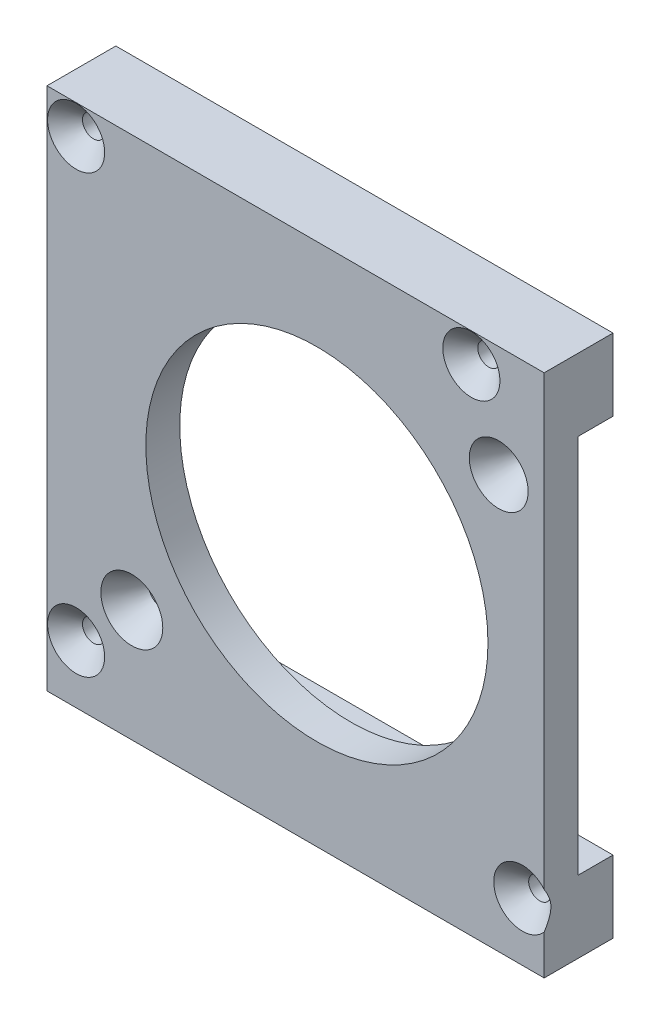
ISO-10303-21;
HEADER;
FILE_DESCRIPTION(('STEP AP214'),'2;1');
FILE_NAME('part.step','',(''),(''),'','','');
FILE_SCHEMA(('AUTOMOTIVE_DESIGN { 1 0 10303 214 1 1 1 1 }'));
ENDSEC;
DATA;
#1=APPLICATION_CONTEXT('core data for automotive mechanical design processes');
#2=APPLICATION_PROTOCOL_DEFINITION('international standard','automotive_design',2000,#1);
#3=PRODUCT_CONTEXT('',#1,'mechanical');
#4=PRODUCT('Part','Part','',(#3));
#5=PRODUCT_RELATED_PRODUCT_CATEGORY('part','',(#4));
#6=PRODUCT_DEFINITION_FORMATION('','',#4);
#7=PRODUCT_DEFINITION_CONTEXT('part definition',#1,'design');
#8=PRODUCT_DEFINITION('design','',#6,#7);
#9=PRODUCT_DEFINITION_SHAPE('','',#8);
#10=(LENGTH_UNIT() NAMED_UNIT(*) SI_UNIT(.MILLI.,.METRE.));
#11=(NAMED_UNIT(*) PLANE_ANGLE_UNIT() SI_UNIT($,.RADIAN.));
#12=(NAMED_UNIT(*) SI_UNIT($,.STERADIAN.) SOLID_ANGLE_UNIT());
#13=UNCERTAINTY_MEASURE_WITH_UNIT(LENGTH_MEASURE(1.E-05),#10,'distance_accuracy_value','');
#14=(GEOMETRIC_REPRESENTATION_CONTEXT(3) GLOBAL_UNCERTAINTY_ASSIGNED_CONTEXT((#13)) GLOBAL_UNIT_ASSIGNED_CONTEXT((#10,
#11,#12)) REPRESENTATION_CONTEXT('',''));
#15=CARTESIAN_POINT('',(0.,0.,0.));
#16=DIRECTION('',(0.,0.,1.));
#17=DIRECTION('',(1.,0.,0.));
#18=AXIS2_PLACEMENT_3D('',#15,#16,#17);
#19=CARTESIAN_POINT('',(-16.575,18.,2.4));
#20=DIRECTION('',(0.,-1.,0.));
#21=DIRECTION('',(0.,0.,-1.));
#22=AXIS2_PLACEMENT_3D('',#19,#20,#21);
#23=PLANE('',#22);
#24=DIRECTION('',(-1.,0.,0.));
#25=VECTOR('',#24,1.);
#26=CARTESIAN_POINT('',(-16.575,18.,0.));
#27=LINE('',#26,#25);
#28=CARTESIAN_POINT('',(16.575,18.,0.));
#29=VERTEX_POINT('',#28);
#30=CARTESIAN_POINT('',(-17.575,18.,0.));
#31=VERTEX_POINT('',#30);
#32=EDGE_CURVE('E117',#29,#31,#27,.T.);
#33=ORIENTED_EDGE('',*,*,#32,.T.);
#34=DIRECTION('',(0.,0.,-1.));
#35=VECTOR('',#34,1.);
#36=CARTESIAN_POINT('',(-17.575,18.,0.));
#37=LINE('',#36,#35);
#38=CARTESIAN_POINT('',(-17.575,18.,4.73));
#39=VERTEX_POINT('',#38);
#40=EDGE_CURVE('E132',#39,#31,#37,.T.);
#41=ORIENTED_EDGE('',*,*,#40,.F.);
#42=DIRECTION('',(-1.,0.,0.));
#43=VECTOR('',#42,1.);
#44=CARTESIAN_POINT('',(0.,18.,4.73));
#45=LINE('',#44,#43);
#46=CARTESIAN_POINT('',(16.575,18.,4.73));
#47=VERTEX_POINT('',#46);
#48=EDGE_CURVE('E152',#47,#39,#45,.T.);
#49=ORIENTED_EDGE('',*,*,#48,.F.);
#50=DIRECTION('',(0.,0.,-1.));
#51=VECTOR('',#50,1.);
#52=CARTESIAN_POINT('',(16.575,18.,2.4));
#53=LINE('',#52,#51);
#54=EDGE_CURVE('E204',#47,#29,#53,.T.);
#55=ORIENTED_EDGE('',*,*,#54,.T.);
#56=EDGE_LOOP('',(#33,#41,#49,#55));
#57=FACE_BOUND('',#56,.T.);
#58=ADVANCED_FACE('F35',(#57),#23,.F.);
#59=CARTESIAN_POINT('',(-16.575,-18.,2.4));
#60=DIRECTION('',(0.,1.,0.));
#61=DIRECTION('',(0.,0.,1.));
#62=AXIS2_PLACEMENT_3D('',#59,#60,#61);
#63=PLANE('',#62);
#64=DIRECTION('',(1.,0.,0.));
#65=VECTOR('',#64,1.);
#66=CARTESIAN_POINT('',(-16.575,-18.,0.));
#67=LINE('',#66,#65);
#68=CARTESIAN_POINT('',(-17.575,-18.,0.));
#69=VERTEX_POINT('',#68);
#70=CARTESIAN_POINT('',(16.575,-18.,0.));
#71=VERTEX_POINT('',#70);
#72=EDGE_CURVE('E106',#69,#71,#67,.T.);
#73=ORIENTED_EDGE('',*,*,#72,.T.);
#74=DIRECTION('',(0.,0.,-1.));
#75=VECTOR('',#74,1.);
#76=CARTESIAN_POINT('',(16.575,-18.,2.4));
#77=LINE('',#76,#75);
#78=CARTESIAN_POINT('',(16.575,-18.,4.73));
#79=VERTEX_POINT('',#78);
#80=EDGE_CURVE('E202',#79,#71,#77,.T.);
#81=ORIENTED_EDGE('',*,*,#80,.F.);
#82=DIRECTION('',(1.,0.,0.));
#83=VECTOR('',#82,1.);
#84=CARTESIAN_POINT('',(0.,-18.,4.73));
#85=LINE('',#84,#83);
#86=CARTESIAN_POINT('',(-17.575,-18.,4.73));
#87=VERTEX_POINT('',#86);
#88=EDGE_CURVE('E123',#87,#79,#85,.T.);
#89=ORIENTED_EDGE('',*,*,#88,.F.);
#90=DIRECTION('',(0.,0.,1.));
#91=VECTOR('',#90,1.);
#92=CARTESIAN_POINT('',(-17.575,-18.,0.));
#93=LINE('',#92,#91);
#94=EDGE_CURVE('E120',#69,#87,#93,.T.);
#95=ORIENTED_EDGE('',*,*,#94,.F.);
#96=EDGE_LOOP('',(#73,#81,#89,#95));
#97=FACE_BOUND('',#96,.T.);
#98=ADVANCED_FACE('F121',(#97),#63,.F.);
#99=CARTESIAN_POINT('',(16.575,-18.,2.4));
#100=DIRECTION('',(-1.,0.,0.));
#101=DIRECTION('',(0.,0.,1.));
#102=AXIS2_PLACEMENT_3D('',#99,#100,#101);
#103=PLANE('',#102);
#104=DIRECTION('',(0.,-1.,0.));
#105=VECTOR('',#104,1.);
#106=CARTESIAN_POINT('',(16.575,0.,4.73));
#107=LINE('',#106,#105);
#108=CARTESIAN_POINT('',(16.575,-12.7353087333266,4.73));
#109=VERTEX_POINT('',#108);
#110=EDGE_CURVE('E150',#47,#109,#107,.T.);
#111=ORIENTED_EDGE('',*,*,#110,.T.);
#112=CARTESIAN_POINT('',(16.575,-12.7353087333266,4.73));
#113=CARTESIAN_POINT('',(16.575,-12.7963130273783,4.69073423713234));
#114=CARTESIAN_POINT('',(16.575,-12.8580699421606,4.65253578036658));
#115=CARTESIAN_POINT('',(16.575,-12.9837158163486,4.57912222659659));
#116=CARTESIAN_POINT('',(16.575,-13.0476135028873,4.54392214792415));
#117=CARTESIAN_POINT('',(16.575,-13.1792623312123,4.47689748044124));
#118=CARTESIAN_POINT('',(16.575,-13.2470702769779,4.44518265509042));
#119=CARTESIAN_POINT('',(16.575,-13.3851596045236,4.38790621905827));
#120=CARTESIAN_POINT('',(16.575,-13.4554360125138,4.36233296667419));
#121=CARTESIAN_POINT('',(16.575,-13.5711303249334,4.32753656385941));
#122=CARTESIAN_POINT('',(16.575,-13.6157913117659,4.31579918830369));
#123=CARTESIAN_POINT('',(16.575,-13.7059222095958,4.29592390504414));
#124=CARTESIAN_POINT('',(16.575,-13.7513921374164,4.28778607228998));
#125=CARTESIAN_POINT('',(16.575,-13.8423707715784,4.27559370105213));
#126=CARTESIAN_POINT('',(16.575,-13.8878734663073,4.27149491958866));
#127=CARTESIAN_POINT('',(16.575,-13.9790631022022,4.26745460991119));
#128=CARTESIAN_POINT('',(16.575,-14.0247500311128,4.26751280958864));
#129=CARTESIAN_POINT('',(16.575,-14.1159293543551,4.27178382735928));
#130=CARTESIAN_POINT('',(16.575,-14.1614217403067,4.27599682264785));
#131=CARTESIAN_POINT('',(16.575,-14.2518804081984,4.28833913317717));
#132=CARTESIAN_POINT('',(16.575,-14.2968464207968,4.29647037070757));
#133=CARTESIAN_POINT('',(16.575,-14.4314783726586,4.32635726146639));
#134=CARTESIAN_POINT('',(16.575,-14.5199564175497,4.35355013084107));
#135=CARTESIAN_POINT('',(16.575,-14.6651739642088,4.40795761615384));
#136=CARTESIAN_POINT('',(16.575,-14.7230264944281,4.4323925345911));
#137=CARTESIAN_POINT('',(16.575,-14.8370607357123,4.48500838399111));
#138=CARTESIAN_POINT('',(16.575,-14.8932410781955,4.51319228540525));
#139=CARTESIAN_POINT('',(16.575,-15.0027170798784,4.57170282659406));
#140=CARTESIAN_POINT('',(16.575,-15.0560496250261,4.60196155139823));
#141=CARTESIAN_POINT('',(16.575,-15.1613268372646,4.66455560195808));
#142=CARTESIAN_POINT('',(16.575,-15.213274315192,4.69688618275704));
#143=CARTESIAN_POINT('',(16.575,-15.2646912666734,4.73));
#144=B_SPLINE_CURVE_WITH_KNOTS('',3,(#112,#113,#114,#115,#116,#117,#118,#119,#120,#121,#122,
#123,#124,#125,#126,#127,#128,#129,#130,#131,#132,#133,#134,#135,#136,#137,#138,#139,#140,#141,
#142,#143),.UNSPECIFIED.,.F.,.F.,(4,2,2,2,2,2,2,2,2,2,2,2,2,2,2,4),(0.,0.217718812860734,
0.43647084792997,0.660834853054086,0.884770145819132,1.02317884737372,1.16159043073768,
1.29846844455074,1.43533749858205,1.57221239011183,1.70915450093612,1.9857751773046,
2.17406493638063,2.36250478274649,2.54640831689804,2.7299047684792),.UNSPECIFIED.);
#145=CARTESIAN_POINT('',(16.575,-15.2646912666734,4.73));
#146=VERTEX_POINT('',#145);
#147=EDGE_CURVE('E51',#109,#146,#144,.T.);
#148=ORIENTED_EDGE('',*,*,#147,.T.);
#149=EDGE_CURVE('E153',#146,#79,#107,.T.);
#150=ORIENTED_EDGE('',*,*,#149,.T.);
#151=ORIENTED_EDGE('',*,*,#80,.T.);
#152=DIRECTION('',(0.,1.,0.));
#153=VECTOR('',#152,1.);
#154=CARTESIAN_POINT('',(16.575,-18.,0.));
#155=LINE('',#154,#153);
#156=CARTESIAN_POINT('',(16.575,-13.05,0.));
#157=VERTEX_POINT('',#156);
#158=EDGE_CURVE('E113',#71,#157,#155,.T.);
#159=ORIENTED_EDGE('',*,*,#158,.T.);
#160=DIRECTION('',(0.,0.,-1.));
#161=VECTOR('',#160,1.);
#162=CARTESIAN_POINT('',(16.575,-13.05,2.4));
#163=LINE('',#162,#161);
#164=CARTESIAN_POINT('',(16.575,-13.05,2.4));
#165=VERTEX_POINT('',#164);
#166=EDGE_CURVE('E199',#165,#157,#163,.T.);
#167=ORIENTED_EDGE('',*,*,#166,.F.);
#168=DIRECTION('',(0.,-1.,0.));
#169=VECTOR('',#168,1.);
#170=CARTESIAN_POINT('',(16.575,0.,2.4));
#171=LINE('',#170,#169);
#172=CARTESIAN_POINT('',(16.575,13.05,2.4));
#173=VERTEX_POINT('',#172);
#174=EDGE_CURVE('E149',#173,#165,#171,.T.);
#175=ORIENTED_EDGE('',*,*,#174,.F.);
#176=DIRECTION('',(0.,0.,-1.));
#177=VECTOR('',#176,1.);
#178=CARTESIAN_POINT('',(16.575,13.05,2.4));
#179=LINE('',#178,#177);
#180=CARTESIAN_POINT('',(16.575,13.05,0.));
#181=VERTEX_POINT('',#180);
#182=EDGE_CURVE('E181',#173,#181,#179,.T.);
#183=ORIENTED_EDGE('',*,*,#182,.T.);
#184=DIRECTION('',(0.,1.,0.));
#185=VECTOR('',#184,1.);
#186=CARTESIAN_POINT('',(16.575,13.05,0.));
#187=LINE('',#186,#185);
#188=EDGE_CURVE('E159',#181,#29,#187,.T.);
#189=ORIENTED_EDGE('',*,*,#188,.T.);
#190=ORIENTED_EDGE('',*,*,#54,.F.);
#191=EDGE_LOOP('',(#111,#148,#150,#151,#159,#167,#175,#183,#189,#190));
#192=FACE_BOUND('',#191,.T.);
#193=ADVANCED_FACE('F246',(#192),#103,.F.);
#194=CARTESIAN_POINT('',(-14.975,-13.05,2.4));
#195=DIRECTION('',(0.,-1.,0.));
#196=DIRECTION('',(0.,0.,-1.));
#197=AXIS2_PLACEMENT_3D('',#194,#195,#196);
#198=PLANE('',#197);
#199=DIRECTION('',(-1.,0.,0.));
#200=VECTOR('',#199,1.);
#201=CARTESIAN_POINT('',(-14.975,-13.05,0.));
#202=LINE('',#201,#200);
#203=CARTESIAN_POINT('',(-14.975,-13.05,0.));
#204=VERTEX_POINT('',#203);
#205=EDGE_CURVE('E186',#157,#204,#202,.T.);
#206=ORIENTED_EDGE('',*,*,#205,.T.);
#207=DIRECTION('',(0.,0.,-1.));
#208=VECTOR('',#207,1.);
#209=CARTESIAN_POINT('',(-14.975,-13.05,2.4));
#210=LINE('',#209,#208);
#211=CARTESIAN_POINT('',(-14.975,-13.05,2.4));
#212=VERTEX_POINT('',#211);
#213=EDGE_CURVE('E196',#212,#204,#210,.T.);
#214=ORIENTED_EDGE('',*,*,#213,.F.);
#215=DIRECTION('',(-1.,0.,0.));
#216=VECTOR('',#215,1.);
#217=CARTESIAN_POINT('',(-14.975,-13.05,2.4));
#218=LINE('',#217,#216);
#219=EDGE_CURVE('E171',#165,#212,#218,.T.);
#220=ORIENTED_EDGE('',*,*,#219,.F.);
#221=ORIENTED_EDGE('',*,*,#166,.T.);
#222=EDGE_LOOP('',(#206,#214,#220,#221));
#223=FACE_BOUND('',#222,.T.);
#224=ADVANCED_FACE('F251',(#223),#198,.F.);
#225=CARTESIAN_POINT('',(-14.975,-13.05,2.4));
#226=DIRECTION('',(-1.,0.,0.));
#227=DIRECTION('',(0.,0.,1.));
#228=AXIS2_PLACEMENT_3D('',#225,#226,#227);
#229=PLANE('',#228);
#230=DIRECTION('',(0.,1.,0.));
#231=VECTOR('',#230,1.);
#232=CARTESIAN_POINT('',(-14.975,-13.05,0.));
#233=LINE('',#232,#231);
#234=CARTESIAN_POINT('',(-14.975,13.05,0.));
#235=VERTEX_POINT('',#234);
#236=EDGE_CURVE('E188',#204,#235,#233,.T.);
#237=ORIENTED_EDGE('',*,*,#236,.T.);
#238=DIRECTION('',(0.,0.,-1.));
#239=VECTOR('',#238,1.);
#240=CARTESIAN_POINT('',(-14.975,13.05,2.4));
#241=LINE('',#240,#239);
#242=CARTESIAN_POINT('',(-14.975,13.05,2.4));
#243=VERTEX_POINT('',#242);
#244=EDGE_CURVE('E193',#243,#235,#241,.T.);
#245=ORIENTED_EDGE('',*,*,#244,.F.);
#246=DIRECTION('',(0.,1.,0.));
#247=VECTOR('',#246,1.);
#248=CARTESIAN_POINT('',(-14.975,-13.05,2.4));
#249=LINE('',#248,#247);
#250=EDGE_CURVE('E174',#212,#243,#249,.T.);
#251=ORIENTED_EDGE('',*,*,#250,.F.);
#252=ORIENTED_EDGE('',*,*,#213,.T.);
#253=EDGE_LOOP('',(#237,#245,#251,#252));
#254=FACE_BOUND('',#253,.T.);
#255=ADVANCED_FACE('F336',(#254),#229,.F.);
#256=CARTESIAN_POINT('',(-14.975,13.05,2.4));
#257=DIRECTION('',(0.,1.,0.));
#258=DIRECTION('',(0.,0.,1.));
#259=AXIS2_PLACEMENT_3D('',#256,#257,#258);
#260=PLANE('',#259);
#261=DIRECTION('',(1.,0.,0.));
#262=VECTOR('',#261,1.);
#263=CARTESIAN_POINT('',(-14.975,13.05,0.));
#264=LINE('',#263,#262);
#265=EDGE_CURVE('E175',#235,#181,#264,.T.);
#266=ORIENTED_EDGE('',*,*,#265,.T.);
#267=ORIENTED_EDGE('',*,*,#182,.F.);
#268=DIRECTION('',(1.,0.,0.));
#269=VECTOR('',#268,1.);
#270=CARTESIAN_POINT('',(-14.975,13.05,2.4));
#271=LINE('',#270,#269);
#272=EDGE_CURVE('E178',#243,#173,#271,.T.);
#273=ORIENTED_EDGE('',*,*,#272,.F.);
#274=ORIENTED_EDGE('',*,*,#244,.T.);
#275=EDGE_LOOP('',(#266,#267,#273,#274));
#276=FACE_BOUND('',#275,.T.);
#277=ADVANCED_FACE('F300',(#276),#260,.F.);
#278=CARTESIAN_POINT('',(0.,0.,0.));
#279=DIRECTION('',(0.,0.,-1.));
#280=DIRECTION('',(-1.,0.,0.));
#281=AXIS2_PLACEMENT_3D('',#278,#279,#280);
#282=PLANE('',#281);
#283=CARTESIAN_POINT('',(15.075,-14.,0.));
#284=DIRECTION('',(0.,0.,-1.));
#285=DIRECTION('',(-1.,0.,0.));
#286=AXIS2_PLACEMENT_3D('',#283,#284,#285);
#287=CIRCLE('',#286,0.762000000000005);
#288=CARTESIAN_POINT('',(14.313,-14.,0.));
#289=VERTEX_POINT('',#288);
#290=EDGE_CURVE('E146',#289,#289,#287,.T.);
#291=ORIENTED_EDGE('',*,*,#290,.F.);
#292=EDGE_LOOP('',(#291));
#293=FACE_BOUND('',#292,.T.);
#294=CARTESIAN_POINT('',(-15.575,-14.,0.));
#295=DIRECTION('',(0.,0.,-1.));
#296=DIRECTION('',(-1.,0.,0.));
#297=AXIS2_PLACEMENT_3D('',#294,#295,#296);
#298=CIRCLE('',#297,0.762000000000001);
#299=CARTESIAN_POINT('',(-16.337,-14.,0.));
#300=VERTEX_POINT('',#299);
#301=EDGE_CURVE('E143',#300,#300,#298,.T.);
#302=ORIENTED_EDGE('',*,*,#301,.F.);
#303=EDGE_LOOP('',(#302));
#304=FACE_BOUND('',#303,.T.);
#305=CARTESIAN_POINT('',(11.575,16.,0.));
#306=DIRECTION('',(0.,0.,-1.));
#307=DIRECTION('',(-1.,0.,0.));
#308=AXIS2_PLACEMENT_3D('',#305,#306,#307);
#309=CIRCLE('',#308,0.762000000000003);
#310=CARTESIAN_POINT('',(10.813,16.,0.));
#311=VERTEX_POINT('',#310);
#312=EDGE_CURVE('E140',#311,#311,#309,.T.);
#313=ORIENTED_EDGE('',*,*,#312,.F.);
#314=EDGE_LOOP('',(#313));
#315=FACE_BOUND('',#314,.T.);
#316=CARTESIAN_POINT('',(-15.575,16.,0.));
#317=DIRECTION('',(0.,0.,-1.));
#318=DIRECTION('',(-1.,0.,0.));
#319=AXIS2_PLACEMENT_3D('',#316,#317,#318);
#320=CIRCLE('',#319,0.762000000000001);
#321=CARTESIAN_POINT('',(-16.337,16.,0.));
#322=VERTEX_POINT('',#321);
#323=EDGE_CURVE('E137',#322,#322,#320,.T.);
#324=ORIENTED_EDGE('',*,*,#323,.F.);
#325=EDGE_LOOP('',(#324));
#326=FACE_BOUND('',#325,.T.);
#327=ORIENTED_EDGE('',*,*,#188,.F.);
#328=ORIENTED_EDGE('',*,*,#265,.F.);
#329=ORIENTED_EDGE('',*,*,#236,.F.);
#330=ORIENTED_EDGE('',*,*,#205,.F.);
#331=ORIENTED_EDGE('',*,*,#158,.F.);
#332=ORIENTED_EDGE('',*,*,#72,.F.);
#333=DIRECTION('',(0.,-1.,0.));
#334=VECTOR('',#333,1.);
#335=CARTESIAN_POINT('',(-17.575,18.,0.));
#336=LINE('',#335,#334);
#337=EDGE_CURVE('E111',#31,#69,#336,.T.);
#338=ORIENTED_EDGE('',*,*,#337,.F.);
#339=ORIENTED_EDGE('',*,*,#32,.F.);
#340=EDGE_LOOP('',(#327,#328,#329,#330,#331,#332,#338,#339));
#341=FACE_BOUND('',#340,.T.);
#342=ADVANCED_FACE('F109',(#293,#304,#315,#326,#341),#282,.T.);
#343=CARTESIAN_POINT('',(0.,0.,2.4));
#344=DIRECTION('',(0.,0.,1.));
#345=DIRECTION('',(1.,0.,0.));
#346=AXIS2_PLACEMENT_3D('',#343,#344,#345);
#347=PLANE('',#346);
#348=CARTESIAN_POINT('',(13.452978113297,10.377978113297,2.4));
#349=DIRECTION('',(0.,0.,1.));
#350=DIRECTION('',(1.,0.,0.));
#351=AXIS2_PLACEMENT_3D('',#348,#349,#350);
#352=CIRCLE('',#351,0.822021886702976);
#353=CARTESIAN_POINT('',(14.275,10.377978113297,2.4));
#354=VERTEX_POINT('',#353);
#355=EDGE_CURVE('E162',#354,#354,#352,.T.);
#356=ORIENTED_EDGE('',*,*,#355,.T.);
#357=EDGE_LOOP('',(#356));
#358=FACE_BOUND('',#357,.T.);
#359=CARTESIAN_POINT('',(0.965000000000001,0.,2.4));
#360=DIRECTION('',(0.,0.,1.));
#361=DIRECTION('',(1.,0.,0.));
#362=AXIS2_PLACEMENT_3D('',#359,#360,#361);
#363=CIRCLE('',#362,11.75);
#364=CARTESIAN_POINT('',(12.715,0.,2.4));
#365=VERTEX_POINT('',#364);
#366=EDGE_CURVE('E165',#365,#365,#363,.T.);
#367=ORIENTED_EDGE('',*,*,#366,.T.);
#368=EDGE_LOOP('',(#367));
#369=FACE_BOUND('',#368,.T.);
#370=CARTESIAN_POINT('',(-11.7478914585298,-10.2728914585298,2.4));
#371=DIRECTION('',(0.,0.,1.));
#372=DIRECTION('',(1.,0.,0.));
#373=AXIS2_PLACEMENT_3D('',#370,#371,#372);
#374=CIRCLE('',#373,0.927108541470152);
#375=CARTESIAN_POINT('',(-10.8207829170597,-10.2728914585298,2.4));
#376=VERTEX_POINT('',#375);
#377=EDGE_CURVE('E168',#376,#376,#374,.T.);
#378=ORIENTED_EDGE('',*,*,#377,.T.);
#379=EDGE_LOOP('',(#378));
#380=FACE_BOUND('',#379,.T.);
#381=ORIENTED_EDGE('',*,*,#174,.T.);
#382=ORIENTED_EDGE('',*,*,#219,.T.);
#383=ORIENTED_EDGE('',*,*,#250,.T.);
#384=ORIENTED_EDGE('',*,*,#272,.T.);
#385=EDGE_LOOP('',(#381,#382,#383,#384));
#386=FACE_BOUND('',#385,.T.);
#387=ADVANCED_FACE('F299',(#358,#369,#380,#386),#347,.F.);
#388=CARTESIAN_POINT('',(0.965000000000001,0.,4.73));
#389=DIRECTION('',(0.,0.,-1.));
#390=DIRECTION('',(-1.,0.,0.));
#391=AXIS2_PLACEMENT_3D('',#388,#389,#390);
#392=CYLINDRICAL_SURFACE('',#391,11.75);
#393=CARTESIAN_POINT('',(0.965000000000001,0.,4.73));
#394=DIRECTION('',(0.,0.,1.));
#395=DIRECTION('',(1.,0.,0.));
#396=AXIS2_PLACEMENT_3D('',#393,#394,#395);
#397=CIRCLE('',#396,11.75);
#398=CARTESIAN_POINT('',(12.715,0.,4.73));
#399=VERTEX_POINT('',#398);
#400=EDGE_CURVE('E156',#399,#399,#397,.T.);
#401=ORIENTED_EDGE('',*,*,#400,.T.);
#402=EDGE_LOOP('',(#401));
#403=FACE_BOUND('',#402,.T.);
#404=ORIENTED_EDGE('',*,*,#366,.F.);
#405=EDGE_LOOP('',(#404));
#406=FACE_BOUND('',#405,.T.);
#407=ADVANCED_FACE('F323',(#403,#406),#392,.F.);
#408=CARTESIAN_POINT('',(13.452978113297,10.377978113297,4.73));
#409=DIRECTION('',(0.,0.,-1.));
#410=DIRECTION('',(-1.,0.,0.));
#411=AXIS2_PLACEMENT_3D('',#408,#409,#410);
#412=CYLINDRICAL_SURFACE('',#411,0.822021886702976);
#413=CARTESIAN_POINT('',(13.452978113297,10.377978113297,2.65153903091734));
#414=DIRECTION('',(0.,0.,1.));
#415=DIRECTION('',(1.,0.,0.));
#416=AXIS2_PLACEMENT_3D('',#413,#414,#415);
#417=CIRCLE('',#416,0.822021886702976);
#418=CARTESIAN_POINT('',(14.275,10.377978113297,2.65153903091734));
#419=VERTEX_POINT('',#418);
#420=EDGE_CURVE('E216',#419,#419,#417,.T.);
#421=ORIENTED_EDGE('',*,*,#420,.T.);
#422=EDGE_LOOP('',(#421));
#423=FACE_BOUND('',#422,.T.);
#424=ORIENTED_EDGE('',*,*,#355,.F.);
#425=EDGE_LOOP('',(#424));
#426=FACE_BOUND('',#425,.T.);
#427=ADVANCED_FACE('F327',(#423,#426),#412,.F.);
#428=CARTESIAN_POINT('',(-11.7478914585298,-10.2728914585298,4.73));
#429=DIRECTION('',(0.,0.,-1.));
#430=DIRECTION('',(-1.,0.,0.));
#431=AXIS2_PLACEMENT_3D('',#428,#429,#430);
#432=CYLINDRICAL_SURFACE('',#431,0.927108541470152);
#433=CARTESIAN_POINT('',(-11.7478914585298,-10.2728914585298,2.65153903091735));
#434=DIRECTION('',(0.,0.,1.));
#435=DIRECTION('',(1.,0.,0.));
#436=AXIS2_PLACEMENT_3D('',#433,#434,#435);
#437=CIRCLE('',#436,0.927108541470152);
#438=CARTESIAN_POINT('',(-10.8207829170597,-10.2728914585298,2.65153903091735));
#439=VERTEX_POINT('',#438);
#440=EDGE_CURVE('E207',#439,#439,#437,.T.);
#441=ORIENTED_EDGE('',*,*,#440,.T.);
#442=EDGE_LOOP('',(#441));
#443=FACE_BOUND('',#442,.T.);
#444=ORIENTED_EDGE('',*,*,#377,.F.);
#445=EDGE_LOOP('',(#444));
#446=FACE_BOUND('',#445,.T.);
#447=ADVANCED_FACE('F319',(#443,#446),#432,.F.);
#448=CARTESIAN_POINT('',(0.,0.,4.73));
#449=DIRECTION('',(0.,0.,1.));
#450=DIRECTION('',(1.,0.,0.));
#451=AXIS2_PLACEMENT_3D('',#448,#449,#450);
#452=PLANE('',#451);
#453=CARTESIAN_POINT('',(-15.575,-14.,4.73));
#454=DIRECTION('',(0.,0.,1.));
#455=DIRECTION('',(1.,0.,0.));
#456=AXIS2_PLACEMENT_3D('',#453,#454,#455);
#457=CIRCLE('',#456,1.962);
#458=CARTESIAN_POINT('',(-13.613,-14.,4.73));
#459=VERTEX_POINT('',#458);
#460=EDGE_CURVE('E230',#459,#459,#457,.F.);
#461=ORIENTED_EDGE('',*,*,#460,.T.);
#462=EDGE_LOOP('',(#461));
#463=FACE_BOUND('',#462,.T.);
#464=CARTESIAN_POINT('',(11.575,16.,4.73));
#465=DIRECTION('',(0.,0.,1.));
#466=DIRECTION('',(1.,0.,0.));
#467=AXIS2_PLACEMENT_3D('',#464,#465,#466);
#468=CIRCLE('',#467,1.962);
#469=CARTESIAN_POINT('',(13.537,16.,4.73));
#470=VERTEX_POINT('',#469);
#471=EDGE_CURVE('E225',#470,#470,#468,.F.);
#472=ORIENTED_EDGE('',*,*,#471,.T.);
#473=EDGE_LOOP('',(#472));
#474=FACE_BOUND('',#473,.T.);
#475=CARTESIAN_POINT('',(-15.575,16.,4.73));
#476=DIRECTION('',(0.,0.,1.));
#477=DIRECTION('',(1.,0.,0.));
#478=AXIS2_PLACEMENT_3D('',#475,#476,#477);
#479=CIRCLE('',#478,1.962);
#480=CARTESIAN_POINT('',(-13.613,16.,4.73));
#481=VERTEX_POINT('',#480);
#482=EDGE_CURVE('E222',#481,#481,#479,.F.);
#483=ORIENTED_EDGE('',*,*,#482,.T.);
#484=EDGE_LOOP('',(#483));
#485=FACE_BOUND('',#484,.T.);
#486=CARTESIAN_POINT('',(-11.7478914585298,-10.2728914585298,4.73));
#487=DIRECTION('',(0.,0.,1.));
#488=DIRECTION('',(1.,0.,0.));
#489=AXIS2_PLACEMENT_3D('',#486,#487,#488);
#490=CIRCLE('',#489,2.12710854147015);
#491=CARTESIAN_POINT('',(-9.62078291705969,-10.2728914585298,4.73));
#492=VERTEX_POINT('',#491);
#493=EDGE_CURVE('E213',#492,#492,#490,.F.);
#494=ORIENTED_EDGE('',*,*,#493,.T.);
#495=EDGE_LOOP('',(#494));
#496=FACE_BOUND('',#495,.T.);
#497=CARTESIAN_POINT('',(13.452978113297,10.377978113297,4.73));
#498=DIRECTION('',(0.,0.,1.));
#499=DIRECTION('',(1.,0.,0.));
#500=AXIS2_PLACEMENT_3D('',#497,#498,#499);
#501=CIRCLE('',#500,2.02202188670298);
#502=CARTESIAN_POINT('',(15.475,10.377978113297,4.73));
#503=VERTEX_POINT('',#502);
#504=EDGE_CURVE('E210',#503,#503,#501,.F.);
#505=ORIENTED_EDGE('',*,*,#504,.T.);
#506=EDGE_LOOP('',(#505));
#507=FACE_BOUND('',#506,.T.);
#508=ORIENTED_EDGE('',*,*,#149,.F.);
#509=CARTESIAN_POINT('',(15.075,-14.,4.73));
#510=DIRECTION('',(0.,0.,1.));
#511=DIRECTION('',(1.,0.,0.));
#512=AXIS2_PLACEMENT_3D('',#509,#510,#511);
#513=CIRCLE('',#512,1.96200000000001);
#514=EDGE_CURVE('E228',#146,#109,#513,.F.);
#515=ORIENTED_EDGE('',*,*,#514,.T.);
#516=ORIENTED_EDGE('',*,*,#110,.F.);
#517=ORIENTED_EDGE('',*,*,#48,.T.);
#518=DIRECTION('',(0.,1.,0.));
#519=VECTOR('',#518,1.);
#520=CARTESIAN_POINT('',(-17.575,18.,4.73));
#521=LINE('',#520,#519);
#522=EDGE_CURVE('E127',#87,#39,#521,.T.);
#523=ORIENTED_EDGE('',*,*,#522,.F.);
#524=ORIENTED_EDGE('',*,*,#88,.T.);
#525=EDGE_LOOP('',(#508,#515,#516,#517,#523,#524));
#526=FACE_BOUND('',#525,.T.);
#527=ORIENTED_EDGE('',*,*,#400,.F.);
#528=EDGE_LOOP('',(#527));
#529=FACE_BOUND('',#528,.T.);
#530=ADVANCED_FACE('F266',(#463,#474,#485,#496,#507,#526,#529),#452,.T.);
#531=CARTESIAN_POINT('',(-11.7478914585298,-10.2728914585298,2.65153903091735));
#532=DIRECTION('',(0.,0.,1.));
#533=DIRECTION('',(1.,0.,0.));
#534=AXIS2_PLACEMENT_3D('',#531,#532,#533);
#535=CONICAL_SURFACE('',#534,0.927108541470152,0.5235987755983);
#536=ORIENTED_EDGE('',*,*,#493,.F.);
#537=EDGE_LOOP('',(#536));
#538=FACE_BOUND('',#537,.T.);
#539=ORIENTED_EDGE('',*,*,#440,.F.);
#540=EDGE_LOOP('',(#539));
#541=FACE_BOUND('',#540,.T.);
#542=ADVANCED_FACE('F259',(#538,#541),#535,.F.);
#543=CARTESIAN_POINT('',(13.452978113297,10.377978113297,2.65153903091734));
#544=DIRECTION('',(0.,0.,1.));
#545=DIRECTION('',(1.,0.,0.));
#546=AXIS2_PLACEMENT_3D('',#543,#544,#545);
#547=CONICAL_SURFACE('',#546,0.822021886702976,0.5235987755983);
#548=ORIENTED_EDGE('',*,*,#504,.F.);
#549=EDGE_LOOP('',(#548));
#550=FACE_BOUND('',#549,.T.);
#551=ORIENTED_EDGE('',*,*,#420,.F.);
#552=EDGE_LOOP('',(#551));
#553=FACE_BOUND('',#552,.T.);
#554=ADVANCED_FACE('F265',(#550,#553),#547,.F.);
#555=CARTESIAN_POINT('',(-15.575,16.,-1.07));
#556=DIRECTION('',(0.,0.,1.));
#557=DIRECTION('',(1.,0.,0.));
#558=AXIS2_PLACEMENT_3D('',#555,#556,#557);
#559=CYLINDRICAL_SURFACE('',#558,0.762000000000001);
#560=CARTESIAN_POINT('',(-15.575,16.,3.53000000000001));
#561=DIRECTION('',(0.,0.,1.));
#562=DIRECTION('',(1.,0.,0.));
#563=AXIS2_PLACEMENT_3D('',#560,#561,#562);
#564=CIRCLE('',#563,0.762000000000001);
#565=CARTESIAN_POINT('',(-14.813,16.,3.53000000000001));
#566=VERTEX_POINT('',#565);
#567=EDGE_CURVE('E11',#566,#566,#564,.T.);
#568=ORIENTED_EDGE('',*,*,#567,.T.);
#569=EDGE_LOOP('',(#568));
#570=FACE_BOUND('',#569,.T.);
#571=ORIENTED_EDGE('',*,*,#323,.T.);
#572=EDGE_LOOP('',(#571));
#573=FACE_BOUND('',#572,.T.);
#574=ADVANCED_FACE('F272',(#570,#573),#559,.F.);
#575=CARTESIAN_POINT('',(11.575,16.,-1.07));
#576=DIRECTION('',(0.,0.,1.));
#577=DIRECTION('',(1.,0.,0.));
#578=AXIS2_PLACEMENT_3D('',#575,#576,#577);
#579=CYLINDRICAL_SURFACE('',#578,0.762000000000003);
#580=CARTESIAN_POINT('',(11.575,16.,3.53000000000001));
#581=DIRECTION('',(0.,0.,1.));
#582=DIRECTION('',(1.,0.,0.));
#583=AXIS2_PLACEMENT_3D('',#580,#581,#582);
#584=CIRCLE('',#583,0.762000000000003);
#585=CARTESIAN_POINT('',(12.337,16.,3.53000000000001));
#586=VERTEX_POINT('',#585);
#587=EDGE_CURVE('E44',#586,#586,#584,.T.);
#588=ORIENTED_EDGE('',*,*,#587,.T.);
#589=EDGE_LOOP('',(#588));
#590=FACE_BOUND('',#589,.T.);
#591=ORIENTED_EDGE('',*,*,#312,.T.);
#592=EDGE_LOOP('',(#591));
#593=FACE_BOUND('',#592,.T.);
#594=ADVANCED_FACE('F293',(#590,#593),#579,.F.);
#595=CARTESIAN_POINT('',(-15.575,-14.,-1.07));
#596=DIRECTION('',(0.,0.,1.));
#597=DIRECTION('',(1.,0.,0.));
#598=AXIS2_PLACEMENT_3D('',#595,#596,#597);
#599=CYLINDRICAL_SURFACE('',#598,0.762000000000001);
#600=CARTESIAN_POINT('',(-15.575,-14.,3.53000000000001));
#601=DIRECTION('',(0.,0.,1.));
#602=DIRECTION('',(1.,0.,0.));
#603=AXIS2_PLACEMENT_3D('',#600,#601,#602);
#604=CIRCLE('',#603,0.762000000000001);
#605=CARTESIAN_POINT('',(-14.813,-14.,3.53000000000001));
#606=VERTEX_POINT('',#605);
#607=EDGE_CURVE('E219',#606,#606,#604,.T.);
#608=ORIENTED_EDGE('',*,*,#607,.T.);
#609=EDGE_LOOP('',(#608));
#610=FACE_BOUND('',#609,.T.);
#611=ORIENTED_EDGE('',*,*,#301,.T.);
#612=EDGE_LOOP('',(#611));
#613=FACE_BOUND('',#612,.T.);
#614=ADVANCED_FACE('F290',(#610,#613),#599,.F.);
#615=CARTESIAN_POINT('',(15.075,-14.,-1.07));
#616=DIRECTION('',(0.,0.,1.));
#617=DIRECTION('',(1.,0.,0.));
#618=AXIS2_PLACEMENT_3D('',#615,#616,#617);
#619=CYLINDRICAL_SURFACE('',#618,0.762000000000005);
#620=CARTESIAN_POINT('',(15.075,-14.,3.52999999999998));
#621=DIRECTION('',(0.,0.,1.));
#622=DIRECTION('',(1.,0.,0.));
#623=AXIS2_PLACEMENT_3D('',#620,#621,#622);
#624=CIRCLE('',#623,0.762000000000005);
#625=CARTESIAN_POINT('',(15.837,-14.,3.52999999999998));
#626=VERTEX_POINT('',#625);
#627=EDGE_CURVE('E233',#626,#626,#624,.T.);
#628=ORIENTED_EDGE('',*,*,#627,.T.);
#629=EDGE_LOOP('',(#628));
#630=FACE_BOUND('',#629,.T.);
#631=ORIENTED_EDGE('',*,*,#290,.T.);
#632=EDGE_LOOP('',(#631));
#633=FACE_BOUND('',#632,.T.);
#634=ADVANCED_FACE('F284',(#630,#633),#619,.F.);
#635=CARTESIAN_POINT('',(-17.575,0.,0.));
#636=DIRECTION('',(-1.,0.,0.));
#637=DIRECTION('',(0.,0.,1.));
#638=AXIS2_PLACEMENT_3D('',#635,#636,#637);
#639=PLANE('',#638);
#640=ORIENTED_EDGE('',*,*,#337,.T.);
#641=ORIENTED_EDGE('',*,*,#94,.T.);
#642=ORIENTED_EDGE('',*,*,#522,.T.);
#643=ORIENTED_EDGE('',*,*,#40,.T.);
#644=EDGE_LOOP('',(#640,#641,#642,#643));
#645=FACE_BOUND('',#644,.T.);
#646=ADVANCED_FACE('F130',(#645),#639,.T.);
#647=CARTESIAN_POINT('',(-15.575,-14.,3.53000000000001));
#648=DIRECTION('',(0.,0.,1.));
#649=DIRECTION('',(1.,0.,0.));
#650=AXIS2_PLACEMENT_3D('',#647,#648,#649);
#651=CONICAL_SURFACE('',#650,0.762000000000001,0.78539816339745);
#652=ORIENTED_EDGE('',*,*,#460,.F.);
#653=EDGE_LOOP('',(#652));
#654=FACE_BOUND('',#653,.T.);
#655=ORIENTED_EDGE('',*,*,#607,.F.);
#656=EDGE_LOOP('',(#655));
#657=FACE_BOUND('',#656,.T.);
#658=ADVANCED_FACE('F274',(#654,#657),#651,.F.);
#659=CARTESIAN_POINT('',(15.075,-14.,3.52999999999998));
#660=DIRECTION('',(0.,0.,1.));
#661=DIRECTION('',(1.,0.,0.));
#662=AXIS2_PLACEMENT_3D('',#659,#660,#661);
#663=CONICAL_SURFACE('',#662,0.762000000000005,0.785398163397444);
#664=ORIENTED_EDGE('',*,*,#147,.F.);
#665=ORIENTED_EDGE('',*,*,#514,.F.);
#666=EDGE_LOOP('',(#664,#665));
#667=FACE_BOUND('',#666,.T.);
#668=ORIENTED_EDGE('',*,*,#627,.F.);
#669=EDGE_LOOP('',(#668));
#670=FACE_BOUND('',#669,.T.);
#671=ADVANCED_FACE('F243',(#667,#670),#663,.F.);
#672=CARTESIAN_POINT('',(11.575,16.,3.53000000000001));
#673=DIRECTION('',(0.,0.,1.));
#674=DIRECTION('',(1.,0.,0.));
#675=AXIS2_PLACEMENT_3D('',#672,#673,#674);
#676=CONICAL_SURFACE('',#675,0.762000000000003,0.78539816339745);
#677=ORIENTED_EDGE('',*,*,#471,.F.);
#678=EDGE_LOOP('',(#677));
#679=FACE_BOUND('',#678,.T.);
#680=ORIENTED_EDGE('',*,*,#587,.F.);
#681=EDGE_LOOP('',(#680));
#682=FACE_BOUND('',#681,.T.);
#683=ADVANCED_FACE('F283',(#679,#682),#676,.F.);
#684=CARTESIAN_POINT('',(-15.575,16.,3.53000000000001));
#685=DIRECTION('',(0.,0.,1.));
#686=DIRECTION('',(1.,0.,0.));
#687=AXIS2_PLACEMENT_3D('',#684,#685,#686);
#688=CONICAL_SURFACE('',#687,0.762000000000001,0.78539816339745);
#689=ORIENTED_EDGE('',*,*,#482,.F.);
#690=EDGE_LOOP('',(#689));
#691=FACE_BOUND('',#690,.T.);
#692=ORIENTED_EDGE('',*,*,#567,.F.);
#693=EDGE_LOOP('',(#692));
#694=FACE_BOUND('',#693,.T.);
#695=ADVANCED_FACE('F38',(#691,#694),#688,.F.);
#696=CLOSED_SHELL('',(#58,#98,#193,#224,#255,#277,#342,#387,#407,#427,#447,#530,#542,#554,#574,
#594,#614,#634,#646,#658,#671,#683,#695));
#697=MANIFOLD_SOLID_BREP('B2',#696);
#698=ADVANCED_BREP_SHAPE_REPRESENTATION('',(#18,#697),#14);
#699=SHAPE_DEFINITION_REPRESENTATION(#9,#698);
ENDSEC;
END-ISO-10303-21;
